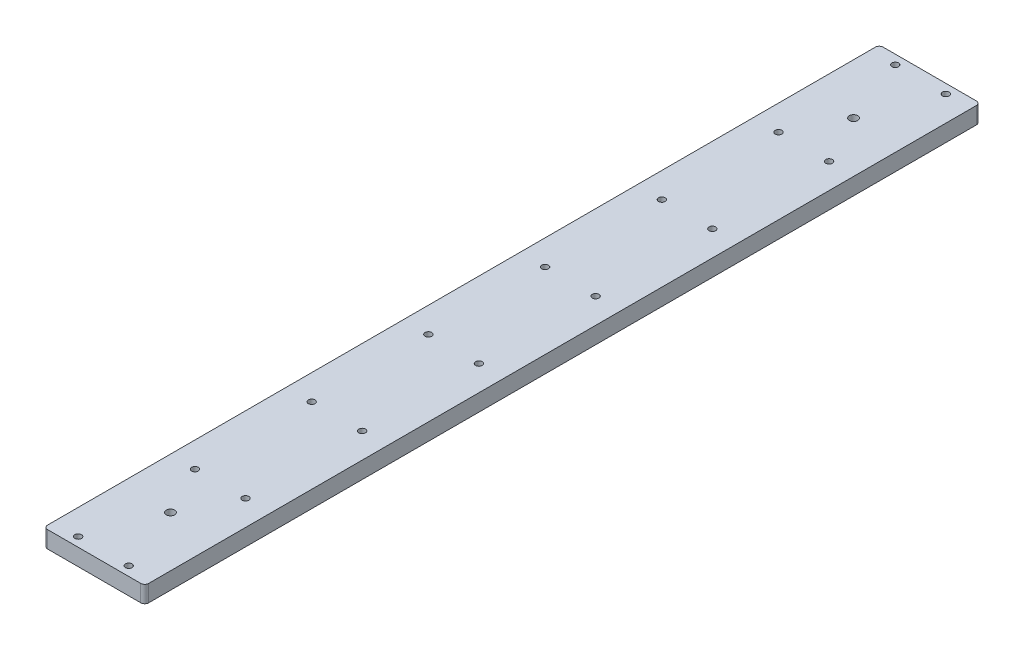
ISO-10303-21;
HEADER;
FILE_DESCRIPTION(('STEP AP214'),'2;1');
FILE_NAME('part.step','',(''),(''),'','','');
FILE_SCHEMA(('AUTOMOTIVE_DESIGN { 1 0 10303 214 1 1 1 1 }'));
ENDSEC;
DATA;
#1=APPLICATION_CONTEXT('core data for automotive mechanical design processes');
#2=APPLICATION_PROTOCOL_DEFINITION('international standard','automotive_design',2000,#1);
#3=PRODUCT_CONTEXT('',#1,'mechanical');
#4=PRODUCT('Part','Part','',(#3));
#5=PRODUCT_RELATED_PRODUCT_CATEGORY('part','',(#4));
#6=PRODUCT_DEFINITION_FORMATION('','',#4);
#7=PRODUCT_DEFINITION_CONTEXT('part definition',#1,'design');
#8=PRODUCT_DEFINITION('design','',#6,#7);
#9=PRODUCT_DEFINITION_SHAPE('','',#8);
#10=(LENGTH_UNIT() NAMED_UNIT(*) SI_UNIT(.MILLI.,.METRE.));
#11=(NAMED_UNIT(*) PLANE_ANGLE_UNIT() SI_UNIT($,.RADIAN.));
#12=(NAMED_UNIT(*) SI_UNIT($,.STERADIAN.) SOLID_ANGLE_UNIT());
#13=UNCERTAINTY_MEASURE_WITH_UNIT(LENGTH_MEASURE(1.E-05),#10,'distance_accuracy_value','');
#14=(GEOMETRIC_REPRESENTATION_CONTEXT(3) GLOBAL_UNCERTAINTY_ASSIGNED_CONTEXT((#13)) GLOBAL_UNIT_ASSIGNED_CONTEXT((#10,
#11,#12)) REPRESENTATION_CONTEXT('',''));
#15=CARTESIAN_POINT('',(0.,0.,0.));
#16=DIRECTION('',(0.,0.,1.));
#17=DIRECTION('',(1.,0.,0.));
#18=AXIS2_PLACEMENT_3D('',#15,#16,#17);
#19=CARTESIAN_POINT('',(-38.1,-6.35,630.));
#20=DIRECTION('',(1.,0.,0.));
#21=DIRECTION('',(0.,0.,-1.));
#22=AXIS2_PLACEMENT_3D('',#19,#20,#21);
#23=PLANE('',#22);
#24=DIRECTION('',(0.,0.,-1.));
#25=VECTOR('',#24,1.);
#26=CARTESIAN_POINT('',(-38.1,6.35,630.));
#27=LINE('',#26,#25);
#28=CARTESIAN_POINT('',(-38.1,6.35,627.));
#29=VERTEX_POINT('',#28);
#30=CARTESIAN_POINT('',(-38.1,6.35,3.));
#31=VERTEX_POINT('',#30);
#32=EDGE_CURVE('E120',#29,#31,#27,.T.);
#33=ORIENTED_EDGE('',*,*,#32,.T.);
#34=DIRECTION('',(0.,-1.,0.));
#35=VECTOR('',#34,1.);
#36=CARTESIAN_POINT('',(-38.1,-6.35,3.));
#37=LINE('',#36,#35);
#38=CARTESIAN_POINT('',(-38.1,-6.35,3.));
#39=VERTEX_POINT('',#38);
#40=EDGE_CURVE('E146',#31,#39,#37,.T.);
#41=ORIENTED_EDGE('',*,*,#40,.T.);
#42=DIRECTION('',(0.,0.,-1.));
#43=VECTOR('',#42,1.);
#44=CARTESIAN_POINT('',(-38.1,-6.35,630.));
#45=LINE('',#44,#43);
#46=CARTESIAN_POINT('',(-38.1,-6.35,627.));
#47=VERTEX_POINT('',#46);
#48=EDGE_CURVE('E124',#47,#39,#45,.T.);
#49=ORIENTED_EDGE('',*,*,#48,.F.);
#50=DIRECTION('',(0.,-1.,0.));
#51=VECTOR('',#50,1.);
#52=CARTESIAN_POINT('',(-38.1,6.35,627.));
#53=LINE('',#52,#51);
#54=EDGE_CURVE('E144',#47,#29,#53,.F.);
#55=ORIENTED_EDGE('',*,*,#54,.T.);
#56=EDGE_LOOP('',(#33,#41,#49,#55));
#57=FACE_BOUND('',#56,.T.);
#58=ADVANCED_FACE('F32',(#57),#23,.F.);
#59=CARTESIAN_POINT('',(38.1,-6.35,630.));
#60=DIRECTION('',(0.,1.,0.));
#61=DIRECTION('',(0.,0.,1.));
#62=AXIS2_PLACEMENT_3D('',#59,#60,#61);
#63=PLANE('',#62);
#64=CARTESIAN_POINT('',(19.0499999999979,-6.35,623.));
#65=DIRECTION('',(0.,-1.,0.));
#66=DIRECTION('',(0.,0.,-1.));
#67=AXIS2_PLACEMENT_3D('',#64,#65,#66);
#68=CIRCLE('',#67,2.5);
#69=CARTESIAN_POINT('',(19.0499999999979,-6.35,620.5));
#70=VERTEX_POINT('',#69);
#71=EDGE_CURVE('E538',#70,#70,#68,.T.);
#72=ORIENTED_EDGE('',*,*,#71,.F.);
#73=EDGE_LOOP('',(#72));
#74=FACE_BOUND('',#73,.T.);
#75=CARTESIAN_POINT('',(19.0499999999982,-6.35,535.));
#76=DIRECTION('',(0.,-1.,0.));
#77=DIRECTION('',(0.,0.,-1.));
#78=AXIS2_PLACEMENT_3D('',#75,#76,#77);
#79=CIRCLE('',#78,2.5);
#80=CARTESIAN_POINT('',(19.0499999999982,-6.35,532.5));
#81=VERTEX_POINT('',#80);
#82=EDGE_CURVE('E532',#81,#81,#79,.T.);
#83=ORIENTED_EDGE('',*,*,#82,.F.);
#84=EDGE_LOOP('',(#83));
#85=FACE_BOUND('',#84,.T.);
#86=CARTESIAN_POINT('',(19.0499999999985,-6.35,447.));
#87=DIRECTION('',(0.,-1.,0.));
#88=DIRECTION('',(0.,0.,-1.));
#89=AXIS2_PLACEMENT_3D('',#86,#87,#88);
#90=CIRCLE('',#89,2.5);
#91=CARTESIAN_POINT('',(19.0499999999985,-6.35,444.5));
#92=VERTEX_POINT('',#91);
#93=EDGE_CURVE('E526',#92,#92,#90,.T.);
#94=ORIENTED_EDGE('',*,*,#93,.F.);
#95=EDGE_LOOP('',(#94));
#96=FACE_BOUND('',#95,.T.);
#97=CARTESIAN_POINT('',(19.0499999999988,-6.35,359.));
#98=DIRECTION('',(0.,-1.,0.));
#99=DIRECTION('',(0.,0.,-1.));
#100=AXIS2_PLACEMENT_3D('',#97,#98,#99);
#101=CIRCLE('',#100,2.5);
#102=CARTESIAN_POINT('',(19.0499999999988,-6.35,356.5));
#103=VERTEX_POINT('',#102);
#104=EDGE_CURVE('E520',#103,#103,#101,.T.);
#105=ORIENTED_EDGE('',*,*,#104,.F.);
#106=EDGE_LOOP('',(#105));
#107=FACE_BOUND('',#106,.T.);
#108=CARTESIAN_POINT('',(19.0499999999991,-6.35,271.));
#109=DIRECTION('',(0.,-1.,0.));
#110=DIRECTION('',(0.,0.,-1.));
#111=AXIS2_PLACEMENT_3D('',#108,#109,#110);
#112=CIRCLE('',#111,2.5);
#113=CARTESIAN_POINT('',(19.0499999999991,-6.35,268.5));
#114=VERTEX_POINT('',#113);
#115=EDGE_CURVE('E514',#114,#114,#112,.T.);
#116=ORIENTED_EDGE('',*,*,#115,.F.);
#117=EDGE_LOOP('',(#116));
#118=FACE_BOUND('',#117,.T.);
#119=CARTESIAN_POINT('',(19.0499999999994,-6.35,183.));
#120=DIRECTION('',(0.,-1.,0.));
#121=DIRECTION('',(0.,0.,-1.));
#122=AXIS2_PLACEMENT_3D('',#119,#120,#121);
#123=CIRCLE('',#122,2.5);
#124=CARTESIAN_POINT('',(19.0499999999994,-6.35,180.5));
#125=VERTEX_POINT('',#124);
#126=EDGE_CURVE('E508',#125,#125,#123,.T.);
#127=ORIENTED_EDGE('',*,*,#126,.F.);
#128=EDGE_LOOP('',(#127));
#129=FACE_BOUND('',#128,.T.);
#130=CARTESIAN_POINT('',(19.0499999999997,-6.35,95.));
#131=DIRECTION('',(0.,-1.,0.));
#132=DIRECTION('',(0.,0.,-1.));
#133=AXIS2_PLACEMENT_3D('',#130,#131,#132);
#134=CIRCLE('',#133,2.5);
#135=CARTESIAN_POINT('',(19.0499999999997,-6.35,92.5));
#136=VERTEX_POINT('',#135);
#137=EDGE_CURVE('E502',#136,#136,#134,.T.);
#138=ORIENTED_EDGE('',*,*,#137,.F.);
#139=EDGE_LOOP('',(#138));
#140=FACE_BOUND('',#139,.T.);
#141=CARTESIAN_POINT('',(-19.0500000000021,-6.35,623.));
#142=DIRECTION('',(0.,-1.,0.));
#143=DIRECTION('',(0.,0.,-1.));
#144=AXIS2_PLACEMENT_3D('',#141,#142,#143);
#145=CIRCLE('',#144,2.5);
#146=CARTESIAN_POINT('',(-19.0500000000021,-6.35,620.5));
#147=VERTEX_POINT('',#146);
#148=EDGE_CURVE('E496',#147,#147,#145,.T.);
#149=ORIENTED_EDGE('',*,*,#148,.F.);
#150=EDGE_LOOP('',(#149));
#151=FACE_BOUND('',#150,.T.);
#152=CARTESIAN_POINT('',(-19.0500000000018,-6.35,535.));
#153=DIRECTION('',(0.,-1.,0.));
#154=DIRECTION('',(0.,0.,-1.));
#155=AXIS2_PLACEMENT_3D('',#152,#153,#154);
#156=CIRCLE('',#155,2.5);
#157=CARTESIAN_POINT('',(-19.0500000000018,-6.35,532.5));
#158=VERTEX_POINT('',#157);
#159=EDGE_CURVE('E490',#158,#158,#156,.T.);
#160=ORIENTED_EDGE('',*,*,#159,.F.);
#161=EDGE_LOOP('',(#160));
#162=FACE_BOUND('',#161,.T.);
#163=CARTESIAN_POINT('',(-19.0500000000015,-6.35,447.));
#164=DIRECTION('',(0.,-1.,0.));
#165=DIRECTION('',(0.,0.,-1.));
#166=AXIS2_PLACEMENT_3D('',#163,#164,#165);
#167=CIRCLE('',#166,2.5);
#168=CARTESIAN_POINT('',(-19.0500000000015,-6.35,444.5));
#169=VERTEX_POINT('',#168);
#170=EDGE_CURVE('E484',#169,#169,#167,.T.);
#171=ORIENTED_EDGE('',*,*,#170,.F.);
#172=EDGE_LOOP('',(#171));
#173=FACE_BOUND('',#172,.T.);
#174=CARTESIAN_POINT('',(-19.0500000000012,-6.35,359.));
#175=DIRECTION('',(0.,-1.,0.));
#176=DIRECTION('',(0.,0.,-1.));
#177=AXIS2_PLACEMENT_3D('',#174,#175,#176);
#178=CIRCLE('',#177,2.5);
#179=CARTESIAN_POINT('',(-19.0500000000012,-6.35,356.5));
#180=VERTEX_POINT('',#179);
#181=EDGE_CURVE('E478',#180,#180,#178,.T.);
#182=ORIENTED_EDGE('',*,*,#181,.F.);
#183=EDGE_LOOP('',(#182));
#184=FACE_BOUND('',#183,.T.);
#185=CARTESIAN_POINT('',(-19.0500000000009,-6.35,271.));
#186=DIRECTION('',(0.,-1.,0.));
#187=DIRECTION('',(0.,0.,-1.));
#188=AXIS2_PLACEMENT_3D('',#185,#186,#187);
#189=CIRCLE('',#188,2.5);
#190=CARTESIAN_POINT('',(-19.0500000000009,-6.35,268.5));
#191=VERTEX_POINT('',#190);
#192=EDGE_CURVE('E472',#191,#191,#189,.T.);
#193=ORIENTED_EDGE('',*,*,#192,.F.);
#194=EDGE_LOOP('',(#193));
#195=FACE_BOUND('',#194,.T.);
#196=CARTESIAN_POINT('',(-19.0500000000006,-6.35,183.));
#197=DIRECTION('',(0.,-1.,0.));
#198=DIRECTION('',(0.,0.,-1.));
#199=AXIS2_PLACEMENT_3D('',#196,#197,#198);
#200=CIRCLE('',#199,2.5);
#201=CARTESIAN_POINT('',(-19.0500000000006,-6.35,180.5));
#202=VERTEX_POINT('',#201);
#203=EDGE_CURVE('E466',#202,#202,#200,.T.);
#204=ORIENTED_EDGE('',*,*,#203,.F.);
#205=EDGE_LOOP('',(#204));
#206=FACE_BOUND('',#205,.T.);
#207=CARTESIAN_POINT('',(-19.0500000000003,-6.35,94.9999999999997));
#208=DIRECTION('',(0.,-1.,0.));
#209=DIRECTION('',(0.,0.,-1.));
#210=AXIS2_PLACEMENT_3D('',#207,#208,#209);
#211=CIRCLE('',#210,2.5);
#212=CARTESIAN_POINT('',(-19.0500000000003,-6.35,92.4999999999997));
#213=VERTEX_POINT('',#212);
#214=EDGE_CURVE('E458',#213,#213,#211,.T.);
#215=ORIENTED_EDGE('',*,*,#214,.F.);
#216=EDGE_LOOP('',(#215));
#217=FACE_BOUND('',#216,.T.);
#218=CARTESIAN_POINT('',(-19.05,-6.35,6.99999999999973));
#219=DIRECTION('',(0.,-1.,0.));
#220=DIRECTION('',(0.,0.,-1.));
#221=AXIS2_PLACEMENT_3D('',#218,#219,#220);
#222=CIRCLE('',#221,2.5);
#223=CARTESIAN_POINT('',(-19.05,-6.35,4.49999999999974));
#224=VERTEX_POINT('',#223);
#225=EDGE_CURVE('E451',#224,#224,#222,.T.);
#226=ORIENTED_EDGE('',*,*,#225,.F.);
#227=EDGE_LOOP('',(#226));
#228=FACE_BOUND('',#227,.T.);
#229=CARTESIAN_POINT('',(19.05,-6.35,7.));
#230=DIRECTION('',(0.,-1.,0.));
#231=DIRECTION('',(0.,0.,-1.));
#232=AXIS2_PLACEMENT_3D('',#229,#230,#231);
#233=CIRCLE('',#232,2.5);
#234=CARTESIAN_POINT('',(19.05,-6.35,4.5));
#235=VERTEX_POINT('',#234);
#236=EDGE_CURVE('E455',#235,#235,#233,.T.);
#237=ORIENTED_EDGE('',*,*,#236,.F.);
#238=EDGE_LOOP('',(#237));
#239=FACE_BOUND('',#238,.T.);
#240=CARTESIAN_POINT('',(0.,-6.35,57.5000000000004));
#241=DIRECTION('',(0.,-1.,0.));
#242=DIRECTION('',(0.,0.,-1.));
#243=AXIS2_PLACEMENT_3D('',#240,#241,#242);
#244=CIRCLE('',#243,3.17499999999998);
#245=CARTESIAN_POINT('',(0.,-6.35,54.3250000000004));
#246=VERTEX_POINT('',#245);
#247=EDGE_CURVE('E548',#246,#246,#244,.T.);
#248=ORIENTED_EDGE('',*,*,#247,.F.);
#249=EDGE_LOOP('',(#248));
#250=FACE_BOUND('',#249,.T.);
#251=CARTESIAN_POINT('',(0.,-6.35,572.5));
#252=DIRECTION('',(0.,-1.,0.));
#253=DIRECTION('',(0.,0.,-1.));
#254=AXIS2_PLACEMENT_3D('',#251,#252,#253);
#255=CIRCLE('',#254,3.17499999999998);
#256=CARTESIAN_POINT('',(0.,-6.35,569.324999999999));
#257=VERTEX_POINT('',#256);
#258=EDGE_CURVE('E159',#257,#257,#255,.T.);
#259=ORIENTED_EDGE('',*,*,#258,.F.);
#260=EDGE_LOOP('',(#259));
#261=FACE_BOUND('',#260,.T.);
#262=DIRECTION('',(1.,0.,0.));
#263=VECTOR('',#262,1.);
#264=CARTESIAN_POINT('',(38.1,-6.35,0.));
#265=LINE('',#264,#263);
#266=CARTESIAN_POINT('',(-35.1,-6.35,0.));
#267=VERTEX_POINT('',#266);
#268=CARTESIAN_POINT('',(35.1,-6.35,0.));
#269=VERTEX_POINT('',#268);
#270=EDGE_CURVE('E156',#267,#269,#265,.T.);
#271=ORIENTED_EDGE('',*,*,#270,.T.);
#272=CARTESIAN_POINT('',(35.1,-6.35,3.));
#273=DIRECTION('',(0.,1.,0.));
#274=DIRECTION('',(0.,0.,1.));
#275=AXIS2_PLACEMENT_3D('',#272,#273,#274);
#276=CIRCLE('',#275,3.);
#277=CARTESIAN_POINT('',(38.1,-6.35,3.));
#278=VERTEX_POINT('',#277);
#279=EDGE_CURVE('E142',#269,#278,#276,.F.);
#280=ORIENTED_EDGE('',*,*,#279,.T.);
#281=DIRECTION('',(0.,0.,-1.));
#282=VECTOR('',#281,1.);
#283=CARTESIAN_POINT('',(38.1,-6.35,630.));
#284=LINE('',#283,#282);
#285=CARTESIAN_POINT('',(38.1,-6.35,627.));
#286=VERTEX_POINT('',#285);
#287=EDGE_CURVE('E119',#286,#278,#284,.T.);
#288=ORIENTED_EDGE('',*,*,#287,.F.);
#289=CARTESIAN_POINT('',(35.1,-6.35,627.));
#290=DIRECTION('',(0.,1.,0.));
#291=DIRECTION('',(0.,0.,1.));
#292=AXIS2_PLACEMENT_3D('',#289,#290,#291);
#293=CIRCLE('',#292,3.);
#294=CARTESIAN_POINT('',(35.1,-6.35,630.));
#295=VERTEX_POINT('',#294);
#296=EDGE_CURVE('E123',#286,#295,#293,.F.);
#297=ORIENTED_EDGE('',*,*,#296,.T.);
#298=DIRECTION('',(1.,0.,0.));
#299=VECTOR('',#298,1.);
#300=CARTESIAN_POINT('',(38.1,-6.35,630.));
#301=LINE('',#300,#299);
#302=CARTESIAN_POINT('',(-35.1,-6.35,630.));
#303=VERTEX_POINT('',#302);
#304=EDGE_CURVE('E151',#303,#295,#301,.T.);
#305=ORIENTED_EDGE('',*,*,#304,.F.);
#306=CARTESIAN_POINT('',(-35.1,-6.35,627.));
#307=DIRECTION('',(0.,1.,0.));
#308=DIRECTION('',(0.,0.,1.));
#309=AXIS2_PLACEMENT_3D('',#306,#307,#308);
#310=CIRCLE('',#309,3.);
#311=EDGE_CURVE('E55',#303,#47,#310,.F.);
#312=ORIENTED_EDGE('',*,*,#311,.T.);
#313=ORIENTED_EDGE('',*,*,#48,.T.);
#314=CARTESIAN_POINT('',(-35.1,-6.35,3.));
#315=DIRECTION('',(0.,1.,0.));
#316=DIRECTION('',(0.,0.,1.));
#317=AXIS2_PLACEMENT_3D('',#314,#315,#316);
#318=CIRCLE('',#317,3.);
#319=EDGE_CURVE('E47',#39,#267,#318,.F.);
#320=ORIENTED_EDGE('',*,*,#319,.T.);
#321=EDGE_LOOP('',(#271,#280,#288,#297,#305,#312,#313,#320));
#322=FACE_BOUND('',#321,.T.);
#323=ADVANCED_FACE('F189',(#74,#85,#96,#107,#118,#129,#140,#151,#162,#173,#184,#195,#206,#217,
#228,#239,#250,#261,#322),#63,.F.);
#324=CARTESIAN_POINT('',(38.1,-6.35,630.));
#325=DIRECTION('',(-1.,0.,0.));
#326=DIRECTION('',(0.,-1.,0.));
#327=AXIS2_PLACEMENT_3D('',#324,#325,#326);
#328=PLANE('',#327);
#329=ORIENTED_EDGE('',*,*,#287,.T.);
#330=DIRECTION('',(0.,1.,0.));
#331=VECTOR('',#330,1.);
#332=CARTESIAN_POINT('',(38.1,-6.35,3.));
#333=LINE('',#332,#331);
#334=CARTESIAN_POINT('',(38.1,6.35,3.));
#335=VERTEX_POINT('',#334);
#336=EDGE_CURVE('E110',#278,#335,#333,.T.);
#337=ORIENTED_EDGE('',*,*,#336,.T.);
#338=DIRECTION('',(0.,0.,-1.));
#339=VECTOR('',#338,1.);
#340=CARTESIAN_POINT('',(38.1,6.35,630.));
#341=LINE('',#340,#339);
#342=CARTESIAN_POINT('',(38.1,6.35,627.));
#343=VERTEX_POINT('',#342);
#344=EDGE_CURVE('E102',#343,#335,#341,.T.);
#345=ORIENTED_EDGE('',*,*,#344,.F.);
#346=DIRECTION('',(0.,1.,0.));
#347=VECTOR('',#346,1.);
#348=CARTESIAN_POINT('',(38.1,-6.35,627.));
#349=LINE('',#348,#347);
#350=EDGE_CURVE('E116',#343,#286,#349,.F.);
#351=ORIENTED_EDGE('',*,*,#350,.T.);
#352=EDGE_LOOP('',(#329,#337,#345,#351));
#353=FACE_BOUND('',#352,.T.);
#354=ADVANCED_FACE('F115',(#353),#328,.F.);
#355=CARTESIAN_POINT('',(38.1,6.35,630.));
#356=DIRECTION('',(0.,-1.,0.));
#357=DIRECTION('',(0.,0.,-1.));
#358=AXIS2_PLACEMENT_3D('',#355,#356,#357);
#359=PLANE('',#358);
#360=CARTESIAN_POINT('',(19.0499999999979,6.35,623.));
#361=DIRECTION('',(0.,-1.,0.));
#362=DIRECTION('',(0.,0.,-1.));
#363=AXIS2_PLACEMENT_3D('',#360,#361,#362);
#364=CIRCLE('',#363,2.5);
#365=CARTESIAN_POINT('',(19.0499999999979,6.35,620.5));
#366=VERTEX_POINT('',#365);
#367=EDGE_CURVE('E535',#366,#366,#364,.T.);
#368=ORIENTED_EDGE('',*,*,#367,.T.);
#369=EDGE_LOOP('',(#368));
#370=FACE_BOUND('',#369,.T.);
#371=CARTESIAN_POINT('',(19.0499999999982,6.35,535.));
#372=DIRECTION('',(0.,-1.,0.));
#373=DIRECTION('',(0.,0.,-1.));
#374=AXIS2_PLACEMENT_3D('',#371,#372,#373);
#375=CIRCLE('',#374,2.5);
#376=CARTESIAN_POINT('',(19.0499999999982,6.35,532.5));
#377=VERTEX_POINT('',#376);
#378=EDGE_CURVE('E529',#377,#377,#375,.T.);
#379=ORIENTED_EDGE('',*,*,#378,.T.);
#380=EDGE_LOOP('',(#379));
#381=FACE_BOUND('',#380,.T.);
#382=CARTESIAN_POINT('',(19.0499999999985,6.35,447.));
#383=DIRECTION('',(0.,-1.,0.));
#384=DIRECTION('',(0.,0.,-1.));
#385=AXIS2_PLACEMENT_3D('',#382,#383,#384);
#386=CIRCLE('',#385,2.5);
#387=CARTESIAN_POINT('',(19.0499999999985,6.35,444.5));
#388=VERTEX_POINT('',#387);
#389=EDGE_CURVE('E523',#388,#388,#386,.T.);
#390=ORIENTED_EDGE('',*,*,#389,.T.);
#391=EDGE_LOOP('',(#390));
#392=FACE_BOUND('',#391,.T.);
#393=CARTESIAN_POINT('',(19.0499999999988,6.35,359.));
#394=DIRECTION('',(0.,-1.,0.));
#395=DIRECTION('',(0.,0.,-1.));
#396=AXIS2_PLACEMENT_3D('',#393,#394,#395);
#397=CIRCLE('',#396,2.5);
#398=CARTESIAN_POINT('',(19.0499999999988,6.35,356.5));
#399=VERTEX_POINT('',#398);
#400=EDGE_CURVE('E517',#399,#399,#397,.T.);
#401=ORIENTED_EDGE('',*,*,#400,.T.);
#402=EDGE_LOOP('',(#401));
#403=FACE_BOUND('',#402,.T.);
#404=CARTESIAN_POINT('',(19.0499999999991,6.35,271.));
#405=DIRECTION('',(0.,-1.,0.));
#406=DIRECTION('',(0.,0.,-1.));
#407=AXIS2_PLACEMENT_3D('',#404,#405,#406);
#408=CIRCLE('',#407,2.5);
#409=CARTESIAN_POINT('',(19.0499999999991,6.35,268.5));
#410=VERTEX_POINT('',#409);
#411=EDGE_CURVE('E511',#410,#410,#408,.T.);
#412=ORIENTED_EDGE('',*,*,#411,.T.);
#413=EDGE_LOOP('',(#412));
#414=FACE_BOUND('',#413,.T.);
#415=CARTESIAN_POINT('',(19.0499999999994,6.35,183.));
#416=DIRECTION('',(0.,-1.,0.));
#417=DIRECTION('',(0.,0.,-1.));
#418=AXIS2_PLACEMENT_3D('',#415,#416,#417);
#419=CIRCLE('',#418,2.5);
#420=CARTESIAN_POINT('',(19.0499999999994,6.35,180.5));
#421=VERTEX_POINT('',#420);
#422=EDGE_CURVE('E505',#421,#421,#419,.T.);
#423=ORIENTED_EDGE('',*,*,#422,.T.);
#424=EDGE_LOOP('',(#423));
#425=FACE_BOUND('',#424,.T.);
#426=CARTESIAN_POINT('',(19.0499999999997,6.35,95.));
#427=DIRECTION('',(0.,-1.,0.));
#428=DIRECTION('',(0.,0.,-1.));
#429=AXIS2_PLACEMENT_3D('',#426,#427,#428);
#430=CIRCLE('',#429,2.5);
#431=CARTESIAN_POINT('',(19.0499999999997,6.35,92.5));
#432=VERTEX_POINT('',#431);
#433=EDGE_CURVE('E499',#432,#432,#430,.T.);
#434=ORIENTED_EDGE('',*,*,#433,.T.);
#435=EDGE_LOOP('',(#434));
#436=FACE_BOUND('',#435,.T.);
#437=CARTESIAN_POINT('',(-19.0500000000021,6.35,623.));
#438=DIRECTION('',(0.,-1.,0.));
#439=DIRECTION('',(0.,0.,-1.));
#440=AXIS2_PLACEMENT_3D('',#437,#438,#439);
#441=CIRCLE('',#440,2.5);
#442=CARTESIAN_POINT('',(-19.0500000000021,6.35,620.5));
#443=VERTEX_POINT('',#442);
#444=EDGE_CURVE('E493',#443,#443,#441,.T.);
#445=ORIENTED_EDGE('',*,*,#444,.T.);
#446=EDGE_LOOP('',(#445));
#447=FACE_BOUND('',#446,.T.);
#448=CARTESIAN_POINT('',(-19.0500000000018,6.35,535.));
#449=DIRECTION('',(0.,-1.,0.));
#450=DIRECTION('',(0.,0.,-1.));
#451=AXIS2_PLACEMENT_3D('',#448,#449,#450);
#452=CIRCLE('',#451,2.5);
#453=CARTESIAN_POINT('',(-19.0500000000018,6.35,532.5));
#454=VERTEX_POINT('',#453);
#455=EDGE_CURVE('E487',#454,#454,#452,.T.);
#456=ORIENTED_EDGE('',*,*,#455,.T.);
#457=EDGE_LOOP('',(#456));
#458=FACE_BOUND('',#457,.T.);
#459=CARTESIAN_POINT('',(-19.0500000000015,6.35,447.));
#460=DIRECTION('',(0.,-1.,0.));
#461=DIRECTION('',(0.,0.,-1.));
#462=AXIS2_PLACEMENT_3D('',#459,#460,#461);
#463=CIRCLE('',#462,2.5);
#464=CARTESIAN_POINT('',(-19.0500000000015,6.35,444.5));
#465=VERTEX_POINT('',#464);
#466=EDGE_CURVE('E481',#465,#465,#463,.T.);
#467=ORIENTED_EDGE('',*,*,#466,.T.);
#468=EDGE_LOOP('',(#467));
#469=FACE_BOUND('',#468,.T.);
#470=CARTESIAN_POINT('',(-19.0500000000012,6.35,359.));
#471=DIRECTION('',(0.,-1.,0.));
#472=DIRECTION('',(0.,0.,-1.));
#473=AXIS2_PLACEMENT_3D('',#470,#471,#472);
#474=CIRCLE('',#473,2.5);
#475=CARTESIAN_POINT('',(-19.0500000000012,6.35,356.5));
#476=VERTEX_POINT('',#475);
#477=EDGE_CURVE('E475',#476,#476,#474,.T.);
#478=ORIENTED_EDGE('',*,*,#477,.T.);
#479=EDGE_LOOP('',(#478));
#480=FACE_BOUND('',#479,.T.);
#481=CARTESIAN_POINT('',(-19.0500000000009,6.35,271.));
#482=DIRECTION('',(0.,-1.,0.));
#483=DIRECTION('',(0.,0.,-1.));
#484=AXIS2_PLACEMENT_3D('',#481,#482,#483);
#485=CIRCLE('',#484,2.5);
#486=CARTESIAN_POINT('',(-19.0500000000009,6.35,268.5));
#487=VERTEX_POINT('',#486);
#488=EDGE_CURVE('E469',#487,#487,#485,.T.);
#489=ORIENTED_EDGE('',*,*,#488,.T.);
#490=EDGE_LOOP('',(#489));
#491=FACE_BOUND('',#490,.T.);
#492=CARTESIAN_POINT('',(-19.0500000000006,6.35,183.));
#493=DIRECTION('',(0.,-1.,0.));
#494=DIRECTION('',(0.,0.,-1.));
#495=AXIS2_PLACEMENT_3D('',#492,#493,#494);
#496=CIRCLE('',#495,2.5);
#497=CARTESIAN_POINT('',(-19.0500000000006,6.35,180.5));
#498=VERTEX_POINT('',#497);
#499=EDGE_CURVE('E463',#498,#498,#496,.T.);
#500=ORIENTED_EDGE('',*,*,#499,.T.);
#501=EDGE_LOOP('',(#500));
#502=FACE_BOUND('',#501,.T.);
#503=CARTESIAN_POINT('',(-19.0500000000003,6.35,94.9999999999997));
#504=DIRECTION('',(0.,-1.,0.));
#505=DIRECTION('',(0.,0.,-1.));
#506=AXIS2_PLACEMENT_3D('',#503,#504,#505);
#507=CIRCLE('',#506,2.5);
#508=CARTESIAN_POINT('',(-19.0500000000003,6.35,92.4999999999997));
#509=VERTEX_POINT('',#508);
#510=EDGE_CURVE('E453',#509,#509,#507,.T.);
#511=ORIENTED_EDGE('',*,*,#510,.T.);
#512=EDGE_LOOP('',(#511));
#513=FACE_BOUND('',#512,.T.);
#514=CARTESIAN_POINT('',(-19.05,6.35,6.99999999999973));
#515=DIRECTION('',(0.,-1.,0.));
#516=DIRECTION('',(0.,0.,-1.));
#517=AXIS2_PLACEMENT_3D('',#514,#515,#516);
#518=CIRCLE('',#517,2.5);
#519=CARTESIAN_POINT('',(-19.05,6.35,4.49999999999974));
#520=VERTEX_POINT('',#519);
#521=EDGE_CURVE('E448',#520,#520,#518,.T.);
#522=ORIENTED_EDGE('',*,*,#521,.T.);
#523=EDGE_LOOP('',(#522));
#524=FACE_BOUND('',#523,.T.);
#525=CARTESIAN_POINT('',(19.05,6.35,7.));
#526=DIRECTION('',(0.,-1.,0.));
#527=DIRECTION('',(0.,0.,-1.));
#528=AXIS2_PLACEMENT_3D('',#525,#526,#527);
#529=CIRCLE('',#528,2.5);
#530=CARTESIAN_POINT('',(19.05,6.35,4.5));
#531=VERTEX_POINT('',#530);
#532=EDGE_CURVE('E541',#531,#531,#529,.T.);
#533=ORIENTED_EDGE('',*,*,#532,.T.);
#534=EDGE_LOOP('',(#533));
#535=FACE_BOUND('',#534,.T.);
#536=CARTESIAN_POINT('',(0.,6.35,57.5000000000004));
#537=DIRECTION('',(0.,-1.,0.));
#538=DIRECTION('',(0.,0.,-1.));
#539=AXIS2_PLACEMENT_3D('',#536,#537,#538);
#540=CIRCLE('',#539,3.17499999999998);
#541=CARTESIAN_POINT('',(0.,6.35,54.3250000000004));
#542=VERTEX_POINT('',#541);
#543=EDGE_CURVE('E163',#542,#542,#540,.T.);
#544=ORIENTED_EDGE('',*,*,#543,.T.);
#545=EDGE_LOOP('',(#544));
#546=FACE_BOUND('',#545,.T.);
#547=CARTESIAN_POINT('',(0.,6.35,572.5));
#548=DIRECTION('',(0.,-1.,0.));
#549=DIRECTION('',(0.,0.,-1.));
#550=AXIS2_PLACEMENT_3D('',#547,#548,#549);
#551=CIRCLE('',#550,3.17499999999998);
#552=CARTESIAN_POINT('',(0.,6.35,569.324999999999));
#553=VERTEX_POINT('',#552);
#554=EDGE_CURVE('E550',#553,#553,#551,.T.);
#555=ORIENTED_EDGE('',*,*,#554,.T.);
#556=EDGE_LOOP('',(#555));
#557=FACE_BOUND('',#556,.T.);
#558=ORIENTED_EDGE('',*,*,#344,.T.);
#559=CARTESIAN_POINT('',(35.1,6.35,3.));
#560=DIRECTION('',(0.,-1.,0.));
#561=DIRECTION('',(0.,0.,-1.));
#562=AXIS2_PLACEMENT_3D('',#559,#560,#561);
#563=CIRCLE('',#562,3.);
#564=CARTESIAN_POINT('',(35.1,6.35,0.));
#565=VERTEX_POINT('',#564);
#566=EDGE_CURVE('E133',#335,#565,#563,.F.);
#567=ORIENTED_EDGE('',*,*,#566,.T.);
#568=DIRECTION('',(-1.,0.,0.));
#569=VECTOR('',#568,1.);
#570=CARTESIAN_POINT('',(38.1,6.35,0.));
#571=LINE('',#570,#569);
#572=CARTESIAN_POINT('',(-35.1,6.35,0.));
#573=VERTEX_POINT('',#572);
#574=EDGE_CURVE('E152',#565,#573,#571,.T.);
#575=ORIENTED_EDGE('',*,*,#574,.T.);
#576=CARTESIAN_POINT('',(-35.1,6.35,3.));
#577=DIRECTION('',(0.,-1.,0.));
#578=DIRECTION('',(0.,0.,-1.));
#579=AXIS2_PLACEMENT_3D('',#576,#577,#578);
#580=CIRCLE('',#579,3.);
#581=EDGE_CURVE('E131',#573,#31,#580,.F.);
#582=ORIENTED_EDGE('',*,*,#581,.T.);
#583=ORIENTED_EDGE('',*,*,#32,.F.);
#584=CARTESIAN_POINT('',(-35.1,6.35,627.));
#585=DIRECTION('',(0.,-1.,0.));
#586=DIRECTION('',(0.,0.,-1.));
#587=AXIS2_PLACEMENT_3D('',#584,#585,#586);
#588=CIRCLE('',#587,3.);
#589=CARTESIAN_POINT('',(-35.1,6.35,630.));
#590=VERTEX_POINT('',#589);
#591=EDGE_CURVE('E109',#29,#590,#588,.F.);
#592=ORIENTED_EDGE('',*,*,#591,.T.);
#593=DIRECTION('',(-1.,0.,0.));
#594=VECTOR('',#593,1.);
#595=CARTESIAN_POINT('',(38.1,6.35,630.));
#596=LINE('',#595,#594);
#597=CARTESIAN_POINT('',(35.1,6.35,630.));
#598=VERTEX_POINT('',#597);
#599=EDGE_CURVE('E104',#598,#590,#596,.T.);
#600=ORIENTED_EDGE('',*,*,#599,.F.);
#601=CARTESIAN_POINT('',(35.1,6.35,627.));
#602=DIRECTION('',(0.,-1.,0.));
#603=DIRECTION('',(0.,0.,-1.));
#604=AXIS2_PLACEMENT_3D('',#601,#602,#603);
#605=CIRCLE('',#604,3.);
#606=EDGE_CURVE('E99',#598,#343,#605,.F.);
#607=ORIENTED_EDGE('',*,*,#606,.T.);
#608=EDGE_LOOP('',(#558,#567,#575,#582,#583,#592,#600,#607));
#609=FACE_BOUND('',#608,.T.);
#610=ADVANCED_FACE('F101',(#370,#381,#392,#403,#414,#425,#436,#447,#458,#469,#480,#491,#502,
#513,#524,#535,#546,#557,#609),#359,.F.);
#611=CARTESIAN_POINT('',(0.,0.,630.));
#612=DIRECTION('',(0.,0.,1.));
#613=DIRECTION('',(1.,0.,0.));
#614=AXIS2_PLACEMENT_3D('',#611,#612,#613);
#615=PLANE('',#614);
#616=ORIENTED_EDGE('',*,*,#599,.T.);
#617=DIRECTION('',(0.,-1.,0.));
#618=VECTOR('',#617,1.);
#619=CARTESIAN_POINT('',(-35.1,-6.35,630.));
#620=LINE('',#619,#618);
#621=EDGE_CURVE('E11',#590,#303,#620,.T.);
#622=ORIENTED_EDGE('',*,*,#621,.T.);
#623=ORIENTED_EDGE('',*,*,#304,.T.);
#624=DIRECTION('',(0.,1.,0.));
#625=VECTOR('',#624,1.);
#626=CARTESIAN_POINT('',(35.1,6.35,630.));
#627=LINE('',#626,#625);
#628=EDGE_CURVE('E40',#295,#598,#627,.T.);
#629=ORIENTED_EDGE('',*,*,#628,.T.);
#630=EDGE_LOOP('',(#616,#622,#623,#629));
#631=FACE_BOUND('',#630,.T.);
#632=ADVANCED_FACE('F149',(#631),#615,.T.);
#633=CARTESIAN_POINT('',(0.,0.,0.));
#634=DIRECTION('',(0.,0.,1.));
#635=DIRECTION('',(1.,0.,0.));
#636=AXIS2_PLACEMENT_3D('',#633,#634,#635);
#637=PLANE('',#636);
#638=ORIENTED_EDGE('',*,*,#574,.F.);
#639=DIRECTION('',(0.,1.,0.));
#640=VECTOR('',#639,1.);
#641=CARTESIAN_POINT('',(35.1,0.,0.));
#642=LINE('',#641,#640);
#643=EDGE_CURVE('E137',#565,#269,#642,.F.);
#644=ORIENTED_EDGE('',*,*,#643,.T.);
#645=ORIENTED_EDGE('',*,*,#270,.F.);
#646=DIRECTION('',(0.,-1.,0.));
#647=VECTOR('',#646,1.);
#648=CARTESIAN_POINT('',(-35.1,0.,0.));
#649=LINE('',#648,#647);
#650=EDGE_CURVE('E135',#267,#573,#649,.F.);
#651=ORIENTED_EDGE('',*,*,#650,.T.);
#652=EDGE_LOOP('',(#638,#644,#645,#651));
#653=FACE_BOUND('',#652,.T.);
#654=ADVANCED_FACE('F173',(#653),#637,.F.);
#655=CARTESIAN_POINT('',(0.,6.35,572.5));
#656=DIRECTION('',(0.,-1.,0.));
#657=DIRECTION('',(0.,0.,-1.));
#658=AXIS2_PLACEMENT_3D('',#655,#656,#657);
#659=CYLINDRICAL_SURFACE('',#658,3.17499999999998);
#660=ORIENTED_EDGE('',*,*,#554,.F.);
#661=EDGE_LOOP('',(#660));
#662=FACE_BOUND('',#661,.T.);
#663=ORIENTED_EDGE('',*,*,#258,.T.);
#664=EDGE_LOOP('',(#663));
#665=FACE_BOUND('',#664,.T.);
#666=ADVANCED_FACE('F224',(#662,#665),#659,.F.);
#667=CARTESIAN_POINT('',(0.,6.35,57.5000000000004));
#668=DIRECTION('',(0.,-1.,0.));
#669=DIRECTION('',(0.,0.,-1.));
#670=AXIS2_PLACEMENT_3D('',#667,#668,#669);
#671=CYLINDRICAL_SURFACE('',#670,3.17499999999998);
#672=ORIENTED_EDGE('',*,*,#543,.F.);
#673=EDGE_LOOP('',(#672));
#674=FACE_BOUND('',#673,.T.);
#675=ORIENTED_EDGE('',*,*,#247,.T.);
#676=EDGE_LOOP('',(#675));
#677=FACE_BOUND('',#676,.T.);
#678=ADVANCED_FACE('F220',(#674,#677),#671,.F.);
#679=CARTESIAN_POINT('',(19.05,6.35,7.));
#680=DIRECTION('',(0.,-1.,0.));
#681=DIRECTION('',(0.,0.,-1.));
#682=AXIS2_PLACEMENT_3D('',#679,#680,#681);
#683=CYLINDRICAL_SURFACE('',#682,2.5);
#684=ORIENTED_EDGE('',*,*,#532,.F.);
#685=EDGE_LOOP('',(#684));
#686=FACE_BOUND('',#685,.T.);
#687=ORIENTED_EDGE('',*,*,#236,.T.);
#688=EDGE_LOOP('',(#687));
#689=FACE_BOUND('',#688,.T.);
#690=ADVANCED_FACE('F216',(#686,#689),#683,.F.);
#691=CARTESIAN_POINT('',(-19.05,6.35,6.99999999999973));
#692=DIRECTION('',(0.,-1.,0.));
#693=DIRECTION('',(0.,0.,-1.));
#694=AXIS2_PLACEMENT_3D('',#691,#692,#693);
#695=CYLINDRICAL_SURFACE('',#694,2.5);
#696=ORIENTED_EDGE('',*,*,#521,.F.);
#697=EDGE_LOOP('',(#696));
#698=FACE_BOUND('',#697,.T.);
#699=ORIENTED_EDGE('',*,*,#225,.T.);
#700=EDGE_LOOP('',(#699));
#701=FACE_BOUND('',#700,.T.);
#702=ADVANCED_FACE('F219',(#698,#701),#695,.F.);
#703=CARTESIAN_POINT('',(-19.0500000000003,6.35,94.9999999999997));
#704=DIRECTION('',(0.,-1.,0.));
#705=DIRECTION('',(0.,0.,-1.));
#706=AXIS2_PLACEMENT_3D('',#703,#704,#705);
#707=CYLINDRICAL_SURFACE('',#706,2.5);
#708=ORIENTED_EDGE('',*,*,#510,.F.);
#709=EDGE_LOOP('',(#708));
#710=FACE_BOUND('',#709,.T.);
#711=ORIENTED_EDGE('',*,*,#214,.T.);
#712=EDGE_LOOP('',(#711));
#713=FACE_BOUND('',#712,.T.);
#714=ADVANCED_FACE('F378',(#710,#713),#707,.F.);
#715=CARTESIAN_POINT('',(-19.0500000000006,6.35,183.));
#716=DIRECTION('',(0.,-1.,0.));
#717=DIRECTION('',(0.,0.,-1.));
#718=AXIS2_PLACEMENT_3D('',#715,#716,#717);
#719=CYLINDRICAL_SURFACE('',#718,2.5);
#720=ORIENTED_EDGE('',*,*,#499,.F.);
#721=EDGE_LOOP('',(#720));
#722=FACE_BOUND('',#721,.T.);
#723=ORIENTED_EDGE('',*,*,#203,.T.);
#724=EDGE_LOOP('',(#723));
#725=FACE_BOUND('',#724,.T.);
#726=ADVANCED_FACE('F369',(#722,#725),#719,.F.);
#727=CARTESIAN_POINT('',(-19.0500000000009,6.35,271.));
#728=DIRECTION('',(0.,-1.,0.));
#729=DIRECTION('',(0.,0.,-1.));
#730=AXIS2_PLACEMENT_3D('',#727,#728,#729);
#731=CYLINDRICAL_SURFACE('',#730,2.5);
#732=ORIENTED_EDGE('',*,*,#488,.F.);
#733=EDGE_LOOP('',(#732));
#734=FACE_BOUND('',#733,.T.);
#735=ORIENTED_EDGE('',*,*,#192,.T.);
#736=EDGE_LOOP('',(#735));
#737=FACE_BOUND('',#736,.T.);
#738=ADVANCED_FACE('F360',(#734,#737),#731,.F.);
#739=CARTESIAN_POINT('',(-19.0500000000012,6.35,359.));
#740=DIRECTION('',(0.,-1.,0.));
#741=DIRECTION('',(0.,0.,-1.));
#742=AXIS2_PLACEMENT_3D('',#739,#740,#741);
#743=CYLINDRICAL_SURFACE('',#742,2.5);
#744=ORIENTED_EDGE('',*,*,#477,.F.);
#745=EDGE_LOOP('',(#744));
#746=FACE_BOUND('',#745,.T.);
#747=ORIENTED_EDGE('',*,*,#181,.T.);
#748=EDGE_LOOP('',(#747));
#749=FACE_BOUND('',#748,.T.);
#750=ADVANCED_FACE('F351',(#746,#749),#743,.F.);
#751=CARTESIAN_POINT('',(-19.0500000000015,6.35,447.));
#752=DIRECTION('',(0.,-1.,0.));
#753=DIRECTION('',(0.,0.,-1.));
#754=AXIS2_PLACEMENT_3D('',#751,#752,#753);
#755=CYLINDRICAL_SURFACE('',#754,2.5);
#756=ORIENTED_EDGE('',*,*,#466,.F.);
#757=EDGE_LOOP('',(#756));
#758=FACE_BOUND('',#757,.T.);
#759=ORIENTED_EDGE('',*,*,#170,.T.);
#760=EDGE_LOOP('',(#759));
#761=FACE_BOUND('',#760,.T.);
#762=ADVANCED_FACE('F342',(#758,#761),#755,.F.);
#763=CARTESIAN_POINT('',(-19.0500000000018,6.35,535.));
#764=DIRECTION('',(0.,-1.,0.));
#765=DIRECTION('',(0.,0.,-1.));
#766=AXIS2_PLACEMENT_3D('',#763,#764,#765);
#767=CYLINDRICAL_SURFACE('',#766,2.5);
#768=ORIENTED_EDGE('',*,*,#455,.F.);
#769=EDGE_LOOP('',(#768));
#770=FACE_BOUND('',#769,.T.);
#771=ORIENTED_EDGE('',*,*,#159,.T.);
#772=EDGE_LOOP('',(#771));
#773=FACE_BOUND('',#772,.T.);
#774=ADVANCED_FACE('F333',(#770,#773),#767,.F.);
#775=CARTESIAN_POINT('',(-19.0500000000021,6.35,623.));
#776=DIRECTION('',(0.,-1.,0.));
#777=DIRECTION('',(0.,0.,-1.));
#778=AXIS2_PLACEMENT_3D('',#775,#776,#777);
#779=CYLINDRICAL_SURFACE('',#778,2.5);
#780=ORIENTED_EDGE('',*,*,#444,.F.);
#781=EDGE_LOOP('',(#780));
#782=FACE_BOUND('',#781,.T.);
#783=ORIENTED_EDGE('',*,*,#148,.T.);
#784=EDGE_LOOP('',(#783));
#785=FACE_BOUND('',#784,.T.);
#786=ADVANCED_FACE('F324',(#782,#785),#779,.F.);
#787=CARTESIAN_POINT('',(19.0499999999997,6.35,95.));
#788=DIRECTION('',(0.,-1.,0.));
#789=DIRECTION('',(0.,0.,-1.));
#790=AXIS2_PLACEMENT_3D('',#787,#788,#789);
#791=CYLINDRICAL_SURFACE('',#790,2.5);
#792=ORIENTED_EDGE('',*,*,#433,.F.);
#793=EDGE_LOOP('',(#792));
#794=FACE_BOUND('',#793,.T.);
#795=ORIENTED_EDGE('',*,*,#137,.T.);
#796=EDGE_LOOP('',(#795));
#797=FACE_BOUND('',#796,.T.);
#798=ADVANCED_FACE('F315',(#794,#797),#791,.F.);
#799=CARTESIAN_POINT('',(19.0499999999994,6.35,183.));
#800=DIRECTION('',(0.,-1.,0.));
#801=DIRECTION('',(0.,0.,-1.));
#802=AXIS2_PLACEMENT_3D('',#799,#800,#801);
#803=CYLINDRICAL_SURFACE('',#802,2.5);
#804=ORIENTED_EDGE('',*,*,#422,.F.);
#805=EDGE_LOOP('',(#804));
#806=FACE_BOUND('',#805,.T.);
#807=ORIENTED_EDGE('',*,*,#126,.T.);
#808=EDGE_LOOP('',(#807));
#809=FACE_BOUND('',#808,.T.);
#810=ADVANCED_FACE('F306',(#806,#809),#803,.F.);
#811=CARTESIAN_POINT('',(19.0499999999991,6.35,271.));
#812=DIRECTION('',(0.,-1.,0.));
#813=DIRECTION('',(0.,0.,-1.));
#814=AXIS2_PLACEMENT_3D('',#811,#812,#813);
#815=CYLINDRICAL_SURFACE('',#814,2.5);
#816=ORIENTED_EDGE('',*,*,#411,.F.);
#817=EDGE_LOOP('',(#816));
#818=FACE_BOUND('',#817,.T.);
#819=ORIENTED_EDGE('',*,*,#115,.T.);
#820=EDGE_LOOP('',(#819));
#821=FACE_BOUND('',#820,.T.);
#822=ADVANCED_FACE('F297',(#818,#821),#815,.F.);
#823=CARTESIAN_POINT('',(19.0499999999988,6.35,359.));
#824=DIRECTION('',(0.,-1.,0.));
#825=DIRECTION('',(0.,0.,-1.));
#826=AXIS2_PLACEMENT_3D('',#823,#824,#825);
#827=CYLINDRICAL_SURFACE('',#826,2.5);
#828=ORIENTED_EDGE('',*,*,#400,.F.);
#829=EDGE_LOOP('',(#828));
#830=FACE_BOUND('',#829,.T.);
#831=ORIENTED_EDGE('',*,*,#104,.T.);
#832=EDGE_LOOP('',(#831));
#833=FACE_BOUND('',#832,.T.);
#834=ADVANCED_FACE('F289',(#830,#833),#827,.F.);
#835=CARTESIAN_POINT('',(19.0499999999985,6.35,447.));
#836=DIRECTION('',(0.,-1.,0.));
#837=DIRECTION('',(0.,0.,-1.));
#838=AXIS2_PLACEMENT_3D('',#835,#836,#837);
#839=CYLINDRICAL_SURFACE('',#838,2.5);
#840=ORIENTED_EDGE('',*,*,#389,.F.);
#841=EDGE_LOOP('',(#840));
#842=FACE_BOUND('',#841,.T.);
#843=ORIENTED_EDGE('',*,*,#93,.T.);
#844=EDGE_LOOP('',(#843));
#845=FACE_BOUND('',#844,.T.);
#846=ADVANCED_FACE('F209',(#842,#845),#839,.F.);
#847=CARTESIAN_POINT('',(19.0499999999982,6.35,535.));
#848=DIRECTION('',(0.,-1.,0.));
#849=DIRECTION('',(0.,0.,-1.));
#850=AXIS2_PLACEMENT_3D('',#847,#848,#849);
#851=CYLINDRICAL_SURFACE('',#850,2.5);
#852=ORIENTED_EDGE('',*,*,#378,.F.);
#853=EDGE_LOOP('',(#852));
#854=FACE_BOUND('',#853,.T.);
#855=ORIENTED_EDGE('',*,*,#82,.T.);
#856=EDGE_LOOP('',(#855));
#857=FACE_BOUND('',#856,.T.);
#858=ADVANCED_FACE('F204',(#854,#857),#851,.F.);
#859=CARTESIAN_POINT('',(19.0499999999979,6.35,623.));
#860=DIRECTION('',(0.,-1.,0.));
#861=DIRECTION('',(0.,0.,-1.));
#862=AXIS2_PLACEMENT_3D('',#859,#860,#861);
#863=CYLINDRICAL_SURFACE('',#862,2.5);
#864=ORIENTED_EDGE('',*,*,#367,.F.);
#865=EDGE_LOOP('',(#864));
#866=FACE_BOUND('',#865,.T.);
#867=ORIENTED_EDGE('',*,*,#71,.T.);
#868=EDGE_LOOP('',(#867));
#869=FACE_BOUND('',#868,.T.);
#870=ADVANCED_FACE('F200',(#866,#869),#863,.F.);
#871=CARTESIAN_POINT('',(35.1,-6.35,3.));
#872=DIRECTION('',(0.,1.,0.));
#873=DIRECTION('',(-1.,0.,0.));
#874=AXIS2_PLACEMENT_3D('',#871,#872,#873);
#875=CYLINDRICAL_SURFACE('',#874,3.);
#876=ORIENTED_EDGE('',*,*,#279,.F.);
#877=ORIENTED_EDGE('',*,*,#643,.F.);
#878=ORIENTED_EDGE('',*,*,#566,.F.);
#879=ORIENTED_EDGE('',*,*,#336,.F.);
#880=EDGE_LOOP('',(#876,#877,#878,#879));
#881=FACE_BOUND('',#880,.T.);
#882=ADVANCED_FACE('F168',(#881),#875,.T.);
#883=CARTESIAN_POINT('',(-35.1,-6.35,3.));
#884=DIRECTION('',(0.,-1.,0.));
#885=DIRECTION('',(0.,0.,-1.));
#886=AXIS2_PLACEMENT_3D('',#883,#884,#885);
#887=CYLINDRICAL_SURFACE('',#886,3.);
#888=ORIENTED_EDGE('',*,*,#581,.F.);
#889=ORIENTED_EDGE('',*,*,#650,.F.);
#890=ORIENTED_EDGE('',*,*,#319,.F.);
#891=ORIENTED_EDGE('',*,*,#40,.F.);
#892=EDGE_LOOP('',(#888,#889,#890,#891));
#893=FACE_BOUND('',#892,.T.);
#894=ADVANCED_FACE('F175',(#893),#887,.T.);
#895=CARTESIAN_POINT('',(-35.1,0.,627.));
#896=DIRECTION('',(0.,1.,0.));
#897=DIRECTION('',(0.,0.,1.));
#898=AXIS2_PLACEMENT_3D('',#895,#896,#897);
#899=CYLINDRICAL_SURFACE('',#898,3.);
#900=ORIENTED_EDGE('',*,*,#591,.F.);
#901=ORIENTED_EDGE('',*,*,#54,.F.);
#902=ORIENTED_EDGE('',*,*,#311,.F.);
#903=ORIENTED_EDGE('',*,*,#621,.F.);
#904=EDGE_LOOP('',(#900,#901,#902,#903));
#905=FACE_BOUND('',#904,.T.);
#906=ADVANCED_FACE('F181',(#905),#899,.T.);
#907=CARTESIAN_POINT('',(35.1,0.,627.));
#908=DIRECTION('',(0.,-1.,0.));
#909=DIRECTION('',(1.,0.,0.));
#910=AXIS2_PLACEMENT_3D('',#907,#908,#909);
#911=CYLINDRICAL_SURFACE('',#910,3.);
#912=ORIENTED_EDGE('',*,*,#296,.F.);
#913=ORIENTED_EDGE('',*,*,#350,.F.);
#914=ORIENTED_EDGE('',*,*,#606,.F.);
#915=ORIENTED_EDGE('',*,*,#628,.F.);
#916=EDGE_LOOP('',(#912,#913,#914,#915));
#917=FACE_BOUND('',#916,.T.);
#918=ADVANCED_FACE('F34',(#917),#911,.T.);
#919=CLOSED_SHELL('',(#58,#323,#354,#610,#632,#654,#666,#678,#690,#702,#714,#726,#738,#750,#762,
#774,#786,#798,#810,#822,#834,#846,#858,#870,#882,#894,#906,#918));
#920=MANIFOLD_SOLID_BREP('B2',#919);
#921=ADVANCED_BREP_SHAPE_REPRESENTATION('',(#18,#920),#14);
#922=SHAPE_DEFINITION_REPRESENTATION(#9,#921);
ENDSEC;
END-ISO-10303-21;
